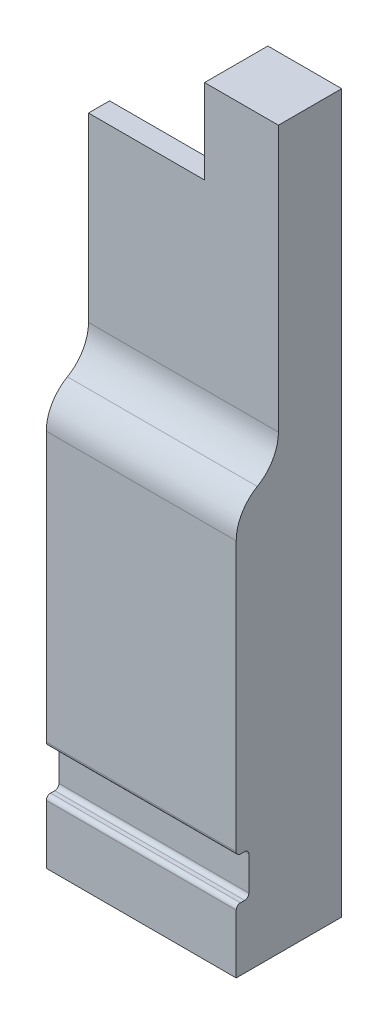
ISO-10303-21;
HEADER;
FILE_DESCRIPTION(('STEP AP214'),'2;1');
FILE_NAME('part.step','',(''),(''),'','','');
FILE_SCHEMA(('AUTOMOTIVE_DESIGN { 1 0 10303 214 1 1 1 1 }'));
ENDSEC;
DATA;
#1=APPLICATION_CONTEXT('core data for automotive mechanical design processes');
#2=APPLICATION_PROTOCOL_DEFINITION('international standard','automotive_design',2000,#1);
#3=PRODUCT_CONTEXT('',#1,'mechanical');
#4=PRODUCT('Part','Part','',(#3));
#5=PRODUCT_RELATED_PRODUCT_CATEGORY('part','',(#4));
#6=PRODUCT_DEFINITION_FORMATION('','',#4);
#7=PRODUCT_DEFINITION_CONTEXT('part definition',#1,'design');
#8=PRODUCT_DEFINITION('design','',#6,#7);
#9=PRODUCT_DEFINITION_SHAPE('','',#8);
#10=(LENGTH_UNIT() NAMED_UNIT(*) SI_UNIT(.MILLI.,.METRE.));
#11=(NAMED_UNIT(*) PLANE_ANGLE_UNIT() SI_UNIT($,.RADIAN.));
#12=(NAMED_UNIT(*) SI_UNIT($,.STERADIAN.) SOLID_ANGLE_UNIT());
#13=UNCERTAINTY_MEASURE_WITH_UNIT(LENGTH_MEASURE(1.E-05),#10,'distance_accuracy_value','');
#14=(GEOMETRIC_REPRESENTATION_CONTEXT(3) GLOBAL_UNCERTAINTY_ASSIGNED_CONTEXT((#13)) GLOBAL_UNIT_ASSIGNED_CONTEXT((#10,
#11,#12)) REPRESENTATION_CONTEXT('',''));
#15=CARTESIAN_POINT('',(0.,0.,0.));
#16=DIRECTION('',(0.,0.,1.));
#17=DIRECTION('',(1.,0.,0.));
#18=AXIS2_PLACEMENT_3D('',#15,#16,#17);
#19=CARTESIAN_POINT('',(40.25,80.25,10.));
#20=DIRECTION('',(0.,1.,0.));
#21=DIRECTION('',(0.,0.,1.));
#22=AXIS2_PLACEMENT_3D('',#19,#20,#21);
#23=PLANE('',#22);
#24=DIRECTION('',(1.,0.,0.));
#25=VECTOR('',#24,1.);
#26=CARTESIAN_POINT('',(40.25,80.25,10.));
#27=LINE('',#26,#25);
#28=CARTESIAN_POINT('',(27.5,80.25,10.));
#29=VERTEX_POINT('',#28);
#30=CARTESIAN_POINT('',(40.25,80.25,10.));
#31=VERTEX_POINT('',#30);
#32=EDGE_CURVE('E298',#29,#31,#27,.T.);
#33=ORIENTED_EDGE('',*,*,#32,.F.);
#34=DIRECTION('',(0.,0.,-1.));
#35=VECTOR('',#34,1.);
#36=CARTESIAN_POINT('',(27.5,80.25,10.));
#37=LINE('',#36,#35);
#38=CARTESIAN_POINT('',(27.5,80.25,0.));
#39=VERTEX_POINT('',#38);
#40=EDGE_CURVE('E344',#29,#39,#37,.T.);
#41=ORIENTED_EDGE('',*,*,#40,.T.);
#42=DIRECTION('',(1.,0.,0.));
#43=VECTOR('',#42,1.);
#44=CARTESIAN_POINT('',(40.25,80.25,0.));
#45=LINE('',#44,#43);
#46=CARTESIAN_POINT('',(40.25,80.25,0.));
#47=VERTEX_POINT('',#46);
#48=EDGE_CURVE('E299',#39,#47,#45,.T.);
#49=ORIENTED_EDGE('',*,*,#48,.T.);
#50=DIRECTION('',(0.,0.,-1.));
#51=VECTOR('',#50,1.);
#52=CARTESIAN_POINT('',(40.25,80.25,10.));
#53=LINE('',#52,#51);
#54=CARTESIAN_POINT('',(40.25,80.25,8.20000000000002));
#55=VERTEX_POINT('',#54);
#56=EDGE_CURVE('E292',#55,#47,#53,.T.);
#57=ORIENTED_EDGE('',*,*,#56,.F.);
#58=DIRECTION('',(1.,0.,0.));
#59=VECTOR('',#58,1.);
#60=CARTESIAN_POINT('',(39.35,80.25,8.20000000000002));
#61=LINE('',#60,#59);
#62=CARTESIAN_POINT('',(39.35,80.25,8.20000000000002));
#63=VERTEX_POINT('',#62);
#64=EDGE_CURVE('E301',#63,#55,#61,.T.);
#65=ORIENTED_EDGE('',*,*,#64,.F.);
#66=DIRECTION('',(0.,0.,-1.));
#67=VECTOR('',#66,1.);
#68=CARTESIAN_POINT('',(39.35,80.25,8.20000000000002));
#69=LINE('',#68,#67);
#70=CARTESIAN_POINT('',(39.35,80.25,8.80000000000002));
#71=VERTEX_POINT('',#70);
#72=EDGE_CURVE('E320',#71,#63,#69,.T.);
#73=ORIENTED_EDGE('',*,*,#72,.F.);
#74=DIRECTION('',(1.,0.,0.));
#75=VECTOR('',#74,1.);
#76=CARTESIAN_POINT('',(39.35,80.25,8.8));
#77=LINE('',#76,#75);
#78=CARTESIAN_POINT('',(40.25,80.25,8.80000000000002));
#79=VERTEX_POINT('',#78);
#80=EDGE_CURVE('E314',#71,#79,#77,.T.);
#81=ORIENTED_EDGE('',*,*,#80,.T.);
#82=EDGE_CURVE('E288',#31,#79,#53,.T.);
#83=ORIENTED_EDGE('',*,*,#82,.F.);
#84=EDGE_LOOP('',(#33,#41,#49,#57,#65,#73,#81,#83));
#85=FACE_BOUND('',#84,.T.);
#86=ADVANCED_FACE('F41',(#85),#23,.F.);
#87=CARTESIAN_POINT('',(-45.,85.,25.));
#88=DIRECTION('',(0.,-1.,0.));
#89=DIRECTION('',(0.,0.,-1.));
#90=AXIS2_PLACEMENT_3D('',#87,#88,#89);
#91=PLANE('',#90);
#92=DIRECTION('',(-1.,0.,0.));
#93=VECTOR('',#92,1.);
#94=CARTESIAN_POINT('',(-45.,85.,0.));
#95=LINE('',#94,#93);
#96=CARTESIAN_POINT('',(45.,85.,0.));
#97=VERTEX_POINT('',#96);
#98=CARTESIAN_POINT('',(27.5,85.,0.));
#99=VERTEX_POINT('',#98);
#100=EDGE_CURVE('E273',#97,#99,#95,.T.);
#101=ORIENTED_EDGE('',*,*,#100,.T.);
#102=DIRECTION('',(0.,0.,1.));
#103=VECTOR('',#102,1.);
#104=CARTESIAN_POINT('',(27.5,85.,25.));
#105=LINE('',#104,#103);
#106=CARTESIAN_POINT('',(27.5,85.,15.));
#107=VERTEX_POINT('',#106);
#108=EDGE_CURVE('E339',#99,#107,#105,.T.);
#109=ORIENTED_EDGE('',*,*,#108,.T.);
#110=DIRECTION('',(-1.,0.,0.));
#111=VECTOR('',#110,1.);
#112=CARTESIAN_POINT('',(45.,85.,15.));
#113=LINE('',#112,#111);
#114=CARTESIAN_POINT('',(45.,85.,15.));
#115=VERTEX_POINT('',#114);
#116=EDGE_CURVE('E279',#115,#107,#113,.T.);
#117=ORIENTED_EDGE('',*,*,#116,.F.);
#118=DIRECTION('',(0.,0.,-1.));
#119=VECTOR('',#118,1.);
#120=CARTESIAN_POINT('',(45.,85.,25.));
#121=LINE('',#120,#119);
#122=EDGE_CURVE('E264',#115,#97,#121,.T.);
#123=ORIENTED_EDGE('',*,*,#122,.T.);
#124=EDGE_LOOP('',(#101,#109,#117,#123));
#125=FACE_BOUND('',#124,.T.);
#126=ADVANCED_FACE('F398',(#125),#91,.F.);
#127=CARTESIAN_POINT('',(0.,0.,0.));
#128=DIRECTION('',(0.,0.,-1.));
#129=DIRECTION('',(-1.,0.,0.));
#130=AXIS2_PLACEMENT_3D('',#127,#128,#129);
#131=PLANE('',#130);
#132=DIRECTION('',(0.,-1.,0.));
#133=VECTOR('',#132,1.);
#134=CARTESIAN_POINT('',(27.5,0.,0.));
#135=LINE('',#134,#133);
#136=EDGE_CURVE('E342',#99,#39,#135,.T.);
#137=ORIENTED_EDGE('',*,*,#136,.F.);
#138=ORIENTED_EDGE('',*,*,#100,.F.);
#139=DIRECTION('',(0.,1.,0.));
#140=VECTOR('',#139,1.);
#141=CARTESIAN_POINT('',(45.,-85.,0.));
#142=LINE('',#141,#140);
#143=CARTESIAN_POINT('',(45.,-85.,0.));
#144=VERTEX_POINT('',#143);
#145=EDGE_CURVE('E276',#144,#97,#142,.T.);
#146=ORIENTED_EDGE('',*,*,#145,.F.);
#147=DIRECTION('',(1.,0.,0.));
#148=VECTOR('',#147,1.);
#149=CARTESIAN_POINT('',(-45.,-85.,0.));
#150=LINE('',#149,#148);
#151=CARTESIAN_POINT('',(40.25,-85.,0.));
#152=VERTEX_POINT('',#151);
#153=EDGE_CURVE('E270',#152,#144,#150,.T.);
#154=ORIENTED_EDGE('',*,*,#153,.F.);
#155=DIRECTION('',(0.,-1.,0.));
#156=VECTOR('',#155,1.);
#157=CARTESIAN_POINT('',(40.25,-85.,0.));
#158=LINE('',#157,#156);
#159=EDGE_CURVE('E295',#47,#152,#158,.T.);
#160=ORIENTED_EDGE('',*,*,#159,.F.);
#161=ORIENTED_EDGE('',*,*,#48,.F.);
#162=EDGE_LOOP('',(#137,#138,#146,#154,#160,#161));
#163=FACE_BOUND('',#162,.T.);
#164=ADVANCED_FACE('F405',(#163),#131,.T.);
#165=CARTESIAN_POINT('',(0.,0.,25.));
#166=DIRECTION('',(0.,0.,-1.));
#167=DIRECTION('',(-1.,0.,0.));
#168=AXIS2_PLACEMENT_3D('',#165,#166,#167);
#169=PLANE('',#168);
#170=DIRECTION('',(1.,0.,0.));
#171=VECTOR('',#170,1.);
#172=CARTESIAN_POINT('',(0.,4.70769186227474,25.));
#173=LINE('',#172,#171);
#174=CARTESIAN_POINT('',(45.,4.70769186227475,25.));
#175=VERTEX_POINT('',#174);
#176=CARTESIAN_POINT('',(0.,4.70769186227474,25.));
#177=VERTEX_POINT('',#176);
#178=EDGE_CURVE('E258',#175,#177,#173,.F.);
#179=ORIENTED_EDGE('',*,*,#178,.T.);
#180=DIRECTION('',(0.,-1.,0.));
#181=VECTOR('',#180,1.);
#182=CARTESIAN_POINT('',(0.,0.,25.));
#183=LINE('',#182,#181);
#184=CARTESIAN_POINT('',(0.,-59.0642013911507,25.));
#185=VERTEX_POINT('',#184);
#186=EDGE_CURVE('E371',#177,#185,#183,.T.);
#187=ORIENTED_EDGE('',*,*,#186,.T.);
#188=DIRECTION('',(-1.,0.,0.));
#189=VECTOR('',#188,1.);
#190=CARTESIAN_POINT('',(0.,-59.0642013911507,25.));
#191=LINE('',#190,#189);
#192=CARTESIAN_POINT('',(45.,-59.0642013911507,25.));
#193=VERTEX_POINT('',#192);
#194=EDGE_CURVE('E241',#185,#193,#191,.F.);
#195=ORIENTED_EDGE('',*,*,#194,.T.);
#196=DIRECTION('',(0.,1.,0.));
#197=VECTOR('',#196,1.);
#198=CARTESIAN_POINT('',(45.,-85.,25.));
#199=LINE('',#198,#197);
#200=EDGE_CURVE('E272',#193,#175,#199,.T.);
#201=ORIENTED_EDGE('',*,*,#200,.T.);
#202=EDGE_LOOP('',(#179,#187,#195,#201));
#203=FACE_BOUND('',#202,.T.);
#204=ADVANCED_FACE('F460',(#203),#169,.F.);
#205=CARTESIAN_POINT('',(40.25,-85.,10.));
#206=DIRECTION('',(1.,0.,0.));
#207=DIRECTION('',(0.,0.,-1.));
#208=AXIS2_PLACEMENT_3D('',#205,#206,#207);
#209=PLANE('',#208);
#210=DIRECTION('',(0.,-1.,0.));
#211=VECTOR('',#210,1.);
#212=CARTESIAN_POINT('',(40.25,-85.,8.20000000000002));
#213=LINE('',#212,#211);
#214=CARTESIAN_POINT('',(40.25,-85.,8.20000000000002));
#215=VERTEX_POINT('',#214);
#216=EDGE_CURVE('E321',#55,#215,#213,.T.);
#217=ORIENTED_EDGE('',*,*,#216,.F.);
#218=ORIENTED_EDGE('',*,*,#56,.T.);
#219=ORIENTED_EDGE('',*,*,#159,.T.);
#220=DIRECTION('',(0.,0.,-1.));
#221=VECTOR('',#220,1.);
#222=CARTESIAN_POINT('',(40.25,-85.,10.));
#223=LINE('',#222,#221);
#224=EDGE_CURVE('E291',#215,#152,#223,.T.);
#225=ORIENTED_EDGE('',*,*,#224,.F.);
#226=EDGE_LOOP('',(#217,#218,#219,#225));
#227=FACE_BOUND('',#226,.T.);
#228=ADVANCED_FACE('F414',(#227),#209,.F.);
#229=DIRECTION('',(0.,1.,0.));
#230=VECTOR('',#229,1.);
#231=CARTESIAN_POINT('',(40.25,80.25,8.8));
#232=LINE('',#231,#230);
#233=CARTESIAN_POINT('',(40.25,-85.,8.80000000000001));
#234=VERTEX_POINT('',#233);
#235=EDGE_CURVE('E317',#234,#79,#232,.T.);
#236=ORIENTED_EDGE('',*,*,#235,.F.);
#237=CARTESIAN_POINT('',(40.25,-85.,10.));
#238=VERTEX_POINT('',#237);
#239=EDGE_CURVE('E287',#238,#234,#223,.T.);
#240=ORIENTED_EDGE('',*,*,#239,.F.);
#241=DIRECTION('',(0.,-1.,0.));
#242=VECTOR('',#241,1.);
#243=CARTESIAN_POINT('',(40.25,-85.,10.));
#244=LINE('',#243,#242);
#245=EDGE_CURVE('E303',#31,#238,#244,.T.);
#246=ORIENTED_EDGE('',*,*,#245,.F.);
#247=ORIENTED_EDGE('',*,*,#82,.T.);
#248=EDGE_LOOP('',(#236,#240,#246,#247));
#249=FACE_BOUND('',#248,.T.);
#250=ADVANCED_FACE('F432',(#249),#209,.F.);
#251=CARTESIAN_POINT('',(45.,-85.,25.));
#252=DIRECTION('',(-1.,0.,0.));
#253=DIRECTION('',(0.,0.,1.));
#254=AXIS2_PLACEMENT_3D('',#251,#252,#253);
#255=PLANE('',#254);
#256=DIRECTION('',(0.,0.,1.));
#257=VECTOR('',#256,1.);
#258=CARTESIAN_POINT('',(45.,-70.0642013911507,22.));
#259=LINE('',#258,#257);
#260=CARTESIAN_POINT('',(45.,-70.0642013911507,23.));
#261=VERTEX_POINT('',#260);
#262=CARTESIAN_POINT('',(45.,-70.0642013911507,24.));
#263=VERTEX_POINT('',#262);
#264=EDGE_CURVE('E333',#261,#263,#259,.T.);
#265=ORIENTED_EDGE('',*,*,#264,.T.);
#266=CARTESIAN_POINT('',(45.,-71.0642013911507,24.));
#267=DIRECTION('',(-1.,0.,0.));
#268=DIRECTION('',(0.,0.,1.));
#269=AXIS2_PLACEMENT_3D('',#266,#267,#268);
#270=CIRCLE('',#269,1.);
#271=CARTESIAN_POINT('',(45.,-71.0642013911507,25.));
#272=VERTEX_POINT('',#271);
#273=EDGE_CURVE('E63',#263,#272,#270,.F.);
#274=ORIENTED_EDGE('',*,*,#273,.T.);
#275=CARTESIAN_POINT('',(45.,-85.,25.));
#276=VERTEX_POINT('',#275);
#277=EDGE_CURVE('E281',#276,#272,#199,.T.);
#278=ORIENTED_EDGE('',*,*,#277,.F.);
#279=DIRECTION('',(0.,0.,-1.));
#280=VECTOR('',#279,1.);
#281=CARTESIAN_POINT('',(45.,-85.,25.));
#282=LINE('',#281,#280);
#283=EDGE_CURVE('E266',#276,#144,#282,.T.);
#284=ORIENTED_EDGE('',*,*,#283,.T.);
#285=ORIENTED_EDGE('',*,*,#145,.T.);
#286=ORIENTED_EDGE('',*,*,#122,.F.);
#287=DIRECTION('',(0.,1.,0.));
#288=VECTOR('',#287,1.);
#289=CARTESIAN_POINT('',(45.,85.,15.));
#290=LINE('',#289,#288);
#291=CARTESIAN_POINT('',(45.,22.0281999379635,15.));
#292=VERTEX_POINT('',#291);
#293=EDGE_CURVE('E285',#292,#115,#290,.T.);
#294=ORIENTED_EDGE('',*,*,#293,.F.);
#295=CARTESIAN_POINT('',(45.,22.0281999379635,25.));
#296=DIRECTION('',(-1.,0.,0.));
#297=DIRECTION('',(0.,0.,1.));
#298=AXIS2_PLACEMENT_3D('',#295,#296,#297);
#299=CIRCLE('',#298,10.);
#300=CARTESIAN_POINT('',(45.,13.3679459001191,20.));
#301=VERTEX_POINT('',#300);
#302=EDGE_CURVE('E251',#292,#301,#299,.T.);
#303=ORIENTED_EDGE('',*,*,#302,.T.);
#304=CARTESIAN_POINT('',(45.,4.70769186227474,15.));
#305=DIRECTION('',(-1.,0.,0.));
#306=DIRECTION('',(0.,0.,1.));
#307=AXIS2_PLACEMENT_3D('',#304,#305,#306);
#308=CIRCLE('',#307,10.);
#309=EDGE_CURVE('E261',#301,#175,#308,.F.);
#310=ORIENTED_EDGE('',*,*,#309,.T.);
#311=ORIENTED_EDGE('',*,*,#200,.F.);
#312=CARTESIAN_POINT('',(45.,-59.0642013911507,24.));
#313=DIRECTION('',(-1.,0.,0.));
#314=DIRECTION('',(0.,0.,1.));
#315=AXIS2_PLACEMENT_3D('',#312,#313,#314);
#316=CIRCLE('',#315,1.);
#317=CARTESIAN_POINT('',(45.,-60.0642013911507,24.));
#318=VERTEX_POINT('',#317);
#319=EDGE_CURVE('E239',#193,#318,#316,.F.);
#320=ORIENTED_EDGE('',*,*,#319,.T.);
#321=DIRECTION('',(0.,0.,1.));
#322=VECTOR('',#321,1.);
#323=CARTESIAN_POINT('',(45.,-60.0642013911507,22.));
#324=LINE('',#323,#322);
#325=CARTESIAN_POINT('',(45.,-60.0642013911507,23.));
#326=VERTEX_POINT('',#325);
#327=EDGE_CURVE('E324',#326,#318,#324,.T.);
#328=ORIENTED_EDGE('',*,*,#327,.F.);
#329=CARTESIAN_POINT('',(45.,-61.0642013911507,23.));
#330=DIRECTION('',(-1.,0.,0.));
#331=DIRECTION('',(0.,0.,1.));
#332=AXIS2_PLACEMENT_3D('',#329,#330,#331);
#333=CIRCLE('',#332,1.);
#334=CARTESIAN_POINT('',(45.,-61.0642013911507,22.));
#335=VERTEX_POINT('',#334);
#336=EDGE_CURVE('E236',#326,#335,#333,.T.);
#337=ORIENTED_EDGE('',*,*,#336,.T.);
#338=DIRECTION('',(0.,1.,0.));
#339=VECTOR('',#338,1.);
#340=CARTESIAN_POINT('',(45.,-70.0642013911507,22.));
#341=LINE('',#340,#339);
#342=CARTESIAN_POINT('',(45.,-69.0642013911507,22.));
#343=VERTEX_POINT('',#342);
#344=EDGE_CURVE('E335',#343,#335,#341,.T.);
#345=ORIENTED_EDGE('',*,*,#344,.F.);
#346=CARTESIAN_POINT('',(45.,-69.0642013911507,23.));
#347=DIRECTION('',(-1.,0.,0.));
#348=DIRECTION('',(0.,0.,1.));
#349=AXIS2_PLACEMENT_3D('',#346,#347,#348);
#350=CIRCLE('',#349,1.);
#351=EDGE_CURVE('E221',#343,#261,#350,.T.);
#352=ORIENTED_EDGE('',*,*,#351,.T.);
#353=EDGE_LOOP('',(#265,#274,#278,#284,#285,#286,#294,#303,#310,#311,#320,#328,#337,#345,#352));
#354=FACE_BOUND('',#353,.T.);
#355=ADVANCED_FACE('F395',(#354),#255,.F.);
#356=CARTESIAN_POINT('',(-45.,-85.,25.));
#357=DIRECTION('',(0.,1.,0.));
#358=DIRECTION('',(0.,0.,1.));
#359=AXIS2_PLACEMENT_3D('',#356,#357,#358);
#360=PLANE('',#359);
#361=DIRECTION('',(1.,0.,0.));
#362=VECTOR('',#361,1.);
#363=CARTESIAN_POINT('',(-45.,-85.,25.));
#364=LINE('',#363,#362);
#365=CARTESIAN_POINT('',(0.,-85.,25.));
#366=VERTEX_POINT('',#365);
#367=EDGE_CURVE('E269',#366,#276,#364,.T.);
#368=ORIENTED_EDGE('',*,*,#367,.F.);
#369=DIRECTION('',(0.,0.,-1.));
#370=VECTOR('',#369,1.);
#371=CARTESIAN_POINT('',(0.,-85.,25.));
#372=LINE('',#371,#370);
#373=CARTESIAN_POINT('',(0.,-85.,10.));
#374=VERTEX_POINT('',#373);
#375=EDGE_CURVE('E382',#366,#374,#372,.T.);
#376=ORIENTED_EDGE('',*,*,#375,.T.);
#377=DIRECTION('',(-1.,0.,0.));
#378=VECTOR('',#377,1.);
#379=CARTESIAN_POINT('',(40.25,-85.,10.));
#380=LINE('',#379,#378);
#381=EDGE_CURVE('E215',#238,#374,#380,.T.);
#382=ORIENTED_EDGE('',*,*,#381,.F.);
#383=ORIENTED_EDGE('',*,*,#239,.T.);
#384=DIRECTION('',(1.,0.,0.));
#385=VECTOR('',#384,1.);
#386=CARTESIAN_POINT('',(39.35,-85.,8.80000000000002));
#387=LINE('',#386,#385);
#388=CARTESIAN_POINT('',(39.35,-85.,8.80000000000002));
#389=VERTEX_POINT('',#388);
#390=EDGE_CURVE('E311',#389,#234,#387,.T.);
#391=ORIENTED_EDGE('',*,*,#390,.F.);
#392=DIRECTION('',(0.,0.,1.));
#393=VECTOR('',#392,1.);
#394=CARTESIAN_POINT('',(39.35,-85.,8.80000000000002));
#395=LINE('',#394,#393);
#396=CARTESIAN_POINT('',(39.35,-85.,8.20000000000002));
#397=VERTEX_POINT('',#396);
#398=EDGE_CURVE('E327',#397,#389,#395,.T.);
#399=ORIENTED_EDGE('',*,*,#398,.F.);
#400=DIRECTION('',(1.,0.,0.));
#401=VECTOR('',#400,1.);
#402=CARTESIAN_POINT('',(39.35,-85.,8.20000000000002));
#403=LINE('',#402,#401);
#404=EDGE_CURVE('E308',#397,#215,#403,.T.);
#405=ORIENTED_EDGE('',*,*,#404,.T.);
#406=ORIENTED_EDGE('',*,*,#224,.T.);
#407=ORIENTED_EDGE('',*,*,#153,.T.);
#408=ORIENTED_EDGE('',*,*,#283,.F.);
#409=EDGE_LOOP('',(#368,#376,#382,#383,#391,#399,#405,#406,#407,#408));
#410=FACE_BOUND('',#409,.T.);
#411=ADVANCED_FACE('F422',(#410),#360,.F.);
#412=DIRECTION('',(1.,0.,0.));
#413=VECTOR('',#412,1.);
#414=CARTESIAN_POINT('',(0.,-71.0642013911507,25.));
#415=LINE('',#414,#413);
#416=CARTESIAN_POINT('',(0.,-71.0642013911507,25.));
#417=VERTEX_POINT('',#416);
#418=EDGE_CURVE('E227',#272,#417,#415,.F.);
#419=ORIENTED_EDGE('',*,*,#418,.T.);
#420=DIRECTION('',(0.,-1.,0.));
#421=VECTOR('',#420,1.);
#422=CARTESIAN_POINT('',(0.,0.,25.));
#423=LINE('',#422,#421);
#424=EDGE_CURVE('E374',#417,#366,#423,.T.);
#425=ORIENTED_EDGE('',*,*,#424,.T.);
#426=ORIENTED_EDGE('',*,*,#367,.T.);
#427=ORIENTED_EDGE('',*,*,#277,.T.);
#428=EDGE_LOOP('',(#419,#425,#426,#427));
#429=FACE_BOUND('',#428,.T.);
#430=ADVANCED_FACE('F456',(#429),#169,.F.);
#431=CARTESIAN_POINT('',(0.,0.,15.));
#432=DIRECTION('',(0.,0.,-1.));
#433=DIRECTION('',(-1.,0.,0.));
#434=AXIS2_PLACEMENT_3D('',#431,#432,#433);
#435=PLANE('',#434);
#436=DIRECTION('',(1.,0.,0.));
#437=VECTOR('',#436,1.);
#438=CARTESIAN_POINT('',(-27.5,65.,15.));
#439=LINE('',#438,#437);
#440=CARTESIAN_POINT('',(0.,65.,15.));
#441=VERTEX_POINT('',#440);
#442=CARTESIAN_POINT('',(27.5,65.,15.));
#443=VERTEX_POINT('',#442);
#444=EDGE_CURVE('E348',#441,#443,#439,.T.);
#445=ORIENTED_EDGE('',*,*,#444,.F.);
#446=DIRECTION('',(0.,-1.,0.));
#447=VECTOR('',#446,1.);
#448=CARTESIAN_POINT('',(0.,0.,15.));
#449=LINE('',#448,#447);
#450=CARTESIAN_POINT('',(0.,22.0281999379635,15.));
#451=VERTEX_POINT('',#450);
#452=EDGE_CURVE('E56',#441,#451,#449,.T.);
#453=ORIENTED_EDGE('',*,*,#452,.T.);
#454=DIRECTION('',(1.,0.,0.));
#455=VECTOR('',#454,1.);
#456=CARTESIAN_POINT('',(0.,22.0281999379635,15.));
#457=LINE('',#456,#455);
#458=EDGE_CURVE('E256',#451,#292,#457,.T.);
#459=ORIENTED_EDGE('',*,*,#458,.T.);
#460=ORIENTED_EDGE('',*,*,#293,.T.);
#461=ORIENTED_EDGE('',*,*,#116,.T.);
#462=DIRECTION('',(0.,1.,0.));
#463=VECTOR('',#462,1.);
#464=CARTESIAN_POINT('',(27.5,105.,15.));
#465=LINE('',#464,#463);
#466=EDGE_CURVE('E350',#443,#107,#465,.T.);
#467=ORIENTED_EDGE('',*,*,#466,.F.);
#468=EDGE_LOOP('',(#445,#453,#459,#460,#461,#467));
#469=FACE_BOUND('',#468,.T.);
#470=ADVANCED_FACE('F386',(#469),#435,.F.);
#471=CARTESIAN_POINT('',(45.,4.70769186227474,15.));
#472=DIRECTION('',(1.,0.,0.));
#473=DIRECTION('',(0.,1.,0.));
#474=AXIS2_PLACEMENT_3D('',#471,#472,#473);
#475=CYLINDRICAL_SURFACE('',#474,10.);
#476=CARTESIAN_POINT('',(0.,4.70769186227474,15.));
#477=DIRECTION('',(1.,0.,0.));
#478=DIRECTION('',(0.,0.,-1.));
#479=AXIS2_PLACEMENT_3D('',#476,#477,#478);
#480=CIRCLE('',#479,10.);
#481=CARTESIAN_POINT('',(0.,13.3679459001191,20.));
#482=VERTEX_POINT('',#481);
#483=EDGE_CURVE('E377',#177,#482,#480,.F.);
#484=ORIENTED_EDGE('',*,*,#483,.F.);
#485=ORIENTED_EDGE('',*,*,#178,.F.);
#486=ORIENTED_EDGE('',*,*,#309,.F.);
#487=DIRECTION('',(1.,0.,0.));
#488=VECTOR('',#487,1.);
#489=CARTESIAN_POINT('',(45.,13.3679459001191,20.));
#490=LINE('',#489,#488);
#491=EDGE_CURVE('E253',#301,#482,#490,.F.);
#492=ORIENTED_EDGE('',*,*,#491,.T.);
#493=EDGE_LOOP('',(#484,#485,#486,#492));
#494=FACE_BOUND('',#493,.T.);
#495=ADVANCED_FACE('F455',(#494),#475,.T.);
#496=CARTESIAN_POINT('',(45.,22.0281999379635,25.));
#497=DIRECTION('',(1.,0.,0.));
#498=DIRECTION('',(0.,1.,0.));
#499=AXIS2_PLACEMENT_3D('',#496,#497,#498);
#500=CYLINDRICAL_SURFACE('',#499,10.);
#501=ORIENTED_EDGE('',*,*,#458,.F.);
#502=CARTESIAN_POINT('',(0.,22.0281999379635,25.));
#503=DIRECTION('',(1.,0.,0.));
#504=DIRECTION('',(0.,0.,-1.));
#505=AXIS2_PLACEMENT_3D('',#502,#503,#504);
#506=CIRCLE('',#505,10.);
#507=EDGE_CURVE('E379',#451,#482,#506,.F.);
#508=ORIENTED_EDGE('',*,*,#507,.T.);
#509=ORIENTED_EDGE('',*,*,#491,.F.);
#510=ORIENTED_EDGE('',*,*,#302,.F.);
#511=EDGE_LOOP('',(#501,#508,#509,#510));
#512=FACE_BOUND('',#511,.T.);
#513=ADVANCED_FACE('F390',(#512),#500,.F.);
#514=CARTESIAN_POINT('',(0.,0.,10.));
#515=DIRECTION('',(0.,0.,1.));
#516=DIRECTION('',(1.,0.,0.));
#517=AXIS2_PLACEMENT_3D('',#514,#515,#516);
#518=PLANE('',#517);
#519=ORIENTED_EDGE('',*,*,#381,.T.);
#520=DIRECTION('',(0.,1.,0.));
#521=VECTOR('',#520,1.);
#522=CARTESIAN_POINT('',(0.,0.,10.));
#523=LINE('',#522,#521);
#524=CARTESIAN_POINT('',(0.,65.,10.));
#525=VERTEX_POINT('',#524);
#526=EDGE_CURVE('E202',#374,#525,#523,.T.);
#527=ORIENTED_EDGE('',*,*,#526,.T.);
#528=DIRECTION('',(1.,0.,0.));
#529=VECTOR('',#528,1.);
#530=CARTESIAN_POINT('',(0.,65.,10.));
#531=LINE('',#530,#529);
#532=CARTESIAN_POINT('',(27.5,65.,10.));
#533=VERTEX_POINT('',#532);
#534=EDGE_CURVE('E211',#525,#533,#531,.T.);
#535=ORIENTED_EDGE('',*,*,#534,.T.);
#536=DIRECTION('',(0.,1.,0.));
#537=VECTOR('',#536,1.);
#538=CARTESIAN_POINT('',(27.5,0.,10.));
#539=LINE('',#538,#537);
#540=EDGE_CURVE('E49',#533,#29,#539,.T.);
#541=ORIENTED_EDGE('',*,*,#540,.T.);
#542=ORIENTED_EDGE('',*,*,#32,.T.);
#543=ORIENTED_EDGE('',*,*,#245,.T.);
#544=EDGE_LOOP('',(#519,#527,#535,#541,#542,#543));
#545=FACE_BOUND('',#544,.T.);
#546=ADVANCED_FACE('F209',(#545),#518,.F.);
#547=CARTESIAN_POINT('',(39.35,-85.,8.20000000000002));
#548=DIRECTION('',(0.,0.,1.));
#549=DIRECTION('',(1.,0.,0.));
#550=AXIS2_PLACEMENT_3D('',#547,#548,#549);
#551=PLANE('',#550);
#552=ORIENTED_EDGE('',*,*,#216,.T.);
#553=ORIENTED_EDGE('',*,*,#404,.F.);
#554=DIRECTION('',(0.,-1.,0.));
#555=VECTOR('',#554,1.);
#556=CARTESIAN_POINT('',(39.35,-85.,8.20000000000002));
#557=LINE('',#556,#555);
#558=EDGE_CURVE('E329',#63,#397,#557,.T.);
#559=ORIENTED_EDGE('',*,*,#558,.F.);
#560=ORIENTED_EDGE('',*,*,#64,.T.);
#561=EDGE_LOOP('',(#552,#553,#559,#560));
#562=FACE_BOUND('',#561,.T.);
#563=ADVANCED_FACE('F417',(#562),#551,.F.);
#564=CARTESIAN_POINT('',(39.35,80.25,8.8));
#565=DIRECTION('',(0.,0.,-1.));
#566=DIRECTION('',(0.,1.,0.));
#567=AXIS2_PLACEMENT_3D('',#564,#565,#566);
#568=PLANE('',#567);
#569=ORIENTED_EDGE('',*,*,#235,.T.);
#570=ORIENTED_EDGE('',*,*,#80,.F.);
#571=DIRECTION('',(0.,1.,0.));
#572=VECTOR('',#571,1.);
#573=CARTESIAN_POINT('',(39.35,80.25,8.8));
#574=LINE('',#573,#572);
#575=EDGE_CURVE('E316',#389,#71,#574,.T.);
#576=ORIENTED_EDGE('',*,*,#575,.F.);
#577=ORIENTED_EDGE('',*,*,#390,.T.);
#578=EDGE_LOOP('',(#569,#570,#576,#577));
#579=FACE_BOUND('',#578,.T.);
#580=ADVANCED_FACE('F433',(#579),#568,.F.);
#581=CARTESIAN_POINT('',(39.35,0.,0.));
#582=DIRECTION('',(1.,0.,0.));
#583=DIRECTION('',(0.,0.,-1.));
#584=AXIS2_PLACEMENT_3D('',#581,#582,#583);
#585=PLANE('',#584);
#586=ORIENTED_EDGE('',*,*,#72,.T.);
#587=ORIENTED_EDGE('',*,*,#558,.T.);
#588=ORIENTED_EDGE('',*,*,#398,.T.);
#589=ORIENTED_EDGE('',*,*,#575,.T.);
#590=EDGE_LOOP('',(#586,#587,#588,#589));
#591=FACE_BOUND('',#590,.T.);
#592=ADVANCED_FACE('F426',(#591),#585,.F.);
#593=CARTESIAN_POINT('',(-45.,-60.0642013911507,22.));
#594=DIRECTION('',(0.,1.,0.));
#595=DIRECTION('',(0.,0.,1.));
#596=AXIS2_PLACEMENT_3D('',#593,#594,#595);
#597=PLANE('',#596);
#598=DIRECTION('',(-1.,0.,0.));
#599=VECTOR('',#598,1.);
#600=CARTESIAN_POINT('',(-45.,-60.0642013911507,24.));
#601=LINE('',#600,#599);
#602=CARTESIAN_POINT('',(0.,-60.0642013911507,24.));
#603=VERTEX_POINT('',#602);
#604=EDGE_CURVE('E245',#318,#603,#601,.T.);
#605=ORIENTED_EDGE('',*,*,#604,.T.);
#606=DIRECTION('',(0.,0.,-1.));
#607=VECTOR('',#606,1.);
#608=CARTESIAN_POINT('',(0.,-60.0642013911507,22.));
#609=LINE('',#608,#607);
#610=CARTESIAN_POINT('',(0.,-60.0642013911507,23.));
#611=VERTEX_POINT('',#610);
#612=EDGE_CURVE('E361',#603,#611,#609,.T.);
#613=ORIENTED_EDGE('',*,*,#612,.T.);
#614=DIRECTION('',(-1.,0.,0.));
#615=VECTOR('',#614,1.);
#616=CARTESIAN_POINT('',(45.,-60.0642013911507,23.));
#617=LINE('',#616,#615);
#618=EDGE_CURVE('E243',#611,#326,#617,.F.);
#619=ORIENTED_EDGE('',*,*,#618,.T.);
#620=ORIENTED_EDGE('',*,*,#327,.T.);
#621=EDGE_LOOP('',(#605,#613,#619,#620));
#622=FACE_BOUND('',#621,.T.);
#623=ADVANCED_FACE('F440',(#622),#597,.F.);
#624=CARTESIAN_POINT('',(-45.,-70.0642013911507,22.));
#625=DIRECTION('',(0.,-1.,0.));
#626=DIRECTION('',(0.,0.,-1.));
#627=AXIS2_PLACEMENT_3D('',#624,#625,#626);
#628=PLANE('',#627);
#629=DIRECTION('',(1.,0.,0.));
#630=VECTOR('',#629,1.);
#631=CARTESIAN_POINT('',(-45.,-70.0642013911507,23.));
#632=LINE('',#631,#630);
#633=CARTESIAN_POINT('',(0.,-70.0642013911507,23.));
#634=VERTEX_POINT('',#633);
#635=EDGE_CURVE('E233',#261,#634,#632,.F.);
#636=ORIENTED_EDGE('',*,*,#635,.T.);
#637=DIRECTION('',(0.,0.,1.));
#638=VECTOR('',#637,1.);
#639=CARTESIAN_POINT('',(0.,-70.0642013911507,22.));
#640=LINE('',#639,#638);
#641=CARTESIAN_POINT('',(0.,-70.0642013911507,24.));
#642=VERTEX_POINT('',#641);
#643=EDGE_CURVE('E364',#634,#642,#640,.T.);
#644=ORIENTED_EDGE('',*,*,#643,.T.);
#645=DIRECTION('',(1.,0.,0.));
#646=VECTOR('',#645,1.);
#647=CARTESIAN_POINT('',(-45.,-70.0642013911507,24.));
#648=LINE('',#647,#646);
#649=EDGE_CURVE('E231',#642,#263,#648,.T.);
#650=ORIENTED_EDGE('',*,*,#649,.T.);
#651=ORIENTED_EDGE('',*,*,#264,.F.);
#652=EDGE_LOOP('',(#636,#644,#650,#651));
#653=FACE_BOUND('',#652,.T.);
#654=ADVANCED_FACE('F491',(#653),#628,.F.);
#655=CARTESIAN_POINT('',(0.,0.,22.));
#656=DIRECTION('',(0.,0.,-1.));
#657=DIRECTION('',(-1.,0.,0.));
#658=AXIS2_PLACEMENT_3D('',#655,#656,#657);
#659=PLANE('',#658);
#660=DIRECTION('',(-1.,0.,0.));
#661=VECTOR('',#660,1.);
#662=CARTESIAN_POINT('',(-45.,-61.0642013911507,22.));
#663=LINE('',#662,#661);
#664=CARTESIAN_POINT('',(0.,-61.0642013911507,22.));
#665=VERTEX_POINT('',#664);
#666=EDGE_CURVE('E248',#335,#665,#663,.T.);
#667=ORIENTED_EDGE('',*,*,#666,.T.);
#668=DIRECTION('',(0.,-1.,0.));
#669=VECTOR('',#668,1.);
#670=CARTESIAN_POINT('',(0.,0.,22.));
#671=LINE('',#670,#669);
#672=CARTESIAN_POINT('',(0.,-69.0642013911507,22.));
#673=VERTEX_POINT('',#672);
#674=EDGE_CURVE('E352',#665,#673,#671,.T.);
#675=ORIENTED_EDGE('',*,*,#674,.T.);
#676=DIRECTION('',(1.,0.,0.));
#677=VECTOR('',#676,1.);
#678=CARTESIAN_POINT('',(45.,-69.0642013911507,22.));
#679=LINE('',#678,#677);
#680=EDGE_CURVE('E223',#673,#343,#679,.T.);
#681=ORIENTED_EDGE('',*,*,#680,.T.);
#682=ORIENTED_EDGE('',*,*,#344,.T.);
#683=EDGE_LOOP('',(#667,#675,#681,#682));
#684=FACE_BOUND('',#683,.T.);
#685=ADVANCED_FACE('F475',(#684),#659,.F.);
#686=CARTESIAN_POINT('',(0.,-61.0642013911507,23.));
#687=DIRECTION('',(1.,0.,0.));
#688=DIRECTION('',(0.,0.,-1.));
#689=AXIS2_PLACEMENT_3D('',#686,#687,#688);
#690=CYLINDRICAL_SURFACE('',#689,1.);
#691=ORIENTED_EDGE('',*,*,#618,.F.);
#692=CARTESIAN_POINT('',(0.,-61.0642013911507,23.));
#693=DIRECTION('',(1.,0.,0.));
#694=DIRECTION('',(0.,0.,-1.));
#695=AXIS2_PLACEMENT_3D('',#692,#693,#694);
#696=CIRCLE('',#695,1.);
#697=EDGE_CURVE('E355',#611,#665,#696,.F.);
#698=ORIENTED_EDGE('',*,*,#697,.T.);
#699=ORIENTED_EDGE('',*,*,#666,.F.);
#700=ORIENTED_EDGE('',*,*,#336,.F.);
#701=EDGE_LOOP('',(#691,#698,#699,#700));
#702=FACE_BOUND('',#701,.T.);
#703=ADVANCED_FACE('F471',(#702),#690,.F.);
#704=CARTESIAN_POINT('',(-45.,-59.0642013911507,24.));
#705=DIRECTION('',(-1.,0.,0.));
#706=DIRECTION('',(0.,0.,1.));
#707=AXIS2_PLACEMENT_3D('',#704,#705,#706);
#708=CYLINDRICAL_SURFACE('',#707,1.);
#709=CARTESIAN_POINT('',(0.,-59.0642013911507,24.));
#710=DIRECTION('',(1.,0.,0.));
#711=DIRECTION('',(0.,0.,-1.));
#712=AXIS2_PLACEMENT_3D('',#709,#710,#711);
#713=CIRCLE('',#712,1.);
#714=EDGE_CURVE('E367',#603,#185,#713,.F.);
#715=ORIENTED_EDGE('',*,*,#714,.F.);
#716=ORIENTED_EDGE('',*,*,#604,.F.);
#717=ORIENTED_EDGE('',*,*,#319,.F.);
#718=ORIENTED_EDGE('',*,*,#194,.F.);
#719=EDGE_LOOP('',(#715,#716,#717,#718));
#720=FACE_BOUND('',#719,.T.);
#721=ADVANCED_FACE('F474',(#720),#708,.T.);
#722=CARTESIAN_POINT('',(-45.,-71.0642013911507,24.));
#723=DIRECTION('',(1.,0.,0.));
#724=DIRECTION('',(0.,0.,-1.));
#725=AXIS2_PLACEMENT_3D('',#722,#723,#724);
#726=CYLINDRICAL_SURFACE('',#725,1.);
#727=CARTESIAN_POINT('',(0.,-71.0642013911507,24.));
#728=DIRECTION('',(1.,0.,0.));
#729=DIRECTION('',(0.,0.,-1.));
#730=AXIS2_PLACEMENT_3D('',#727,#728,#729);
#731=CIRCLE('',#730,1.);
#732=EDGE_CURVE('E369',#417,#642,#731,.F.);
#733=ORIENTED_EDGE('',*,*,#732,.F.);
#734=ORIENTED_EDGE('',*,*,#418,.F.);
#735=ORIENTED_EDGE('',*,*,#273,.F.);
#736=ORIENTED_EDGE('',*,*,#649,.F.);
#737=EDGE_LOOP('',(#733,#734,#735,#736));
#738=FACE_BOUND('',#737,.T.);
#739=ADVANCED_FACE('F478',(#738),#726,.T.);
#740=CARTESIAN_POINT('',(0.,-69.0642013911507,23.));
#741=DIRECTION('',(-1.,0.,0.));
#742=DIRECTION('',(0.,0.,1.));
#743=AXIS2_PLACEMENT_3D('',#740,#741,#742);
#744=CYLINDRICAL_SURFACE('',#743,1.);
#745=ORIENTED_EDGE('',*,*,#680,.F.);
#746=CARTESIAN_POINT('',(0.,-69.0642013911507,23.));
#747=DIRECTION('',(1.,0.,0.));
#748=DIRECTION('',(0.,0.,-1.));
#749=AXIS2_PLACEMENT_3D('',#746,#747,#748);
#750=CIRCLE('',#749,1.);
#751=EDGE_CURVE('E358',#673,#634,#750,.F.);
#752=ORIENTED_EDGE('',*,*,#751,.T.);
#753=ORIENTED_EDGE('',*,*,#635,.F.);
#754=ORIENTED_EDGE('',*,*,#351,.F.);
#755=EDGE_LOOP('',(#745,#752,#753,#754));
#756=FACE_BOUND('',#755,.T.);
#757=ADVANCED_FACE('F43',(#756),#744,.F.);
#758=CARTESIAN_POINT('',(27.5,105.,-5.));
#759=DIRECTION('',(1.,0.,0.));
#760=DIRECTION('',(0.,1.,0.));
#761=AXIS2_PLACEMENT_3D('',#758,#759,#760);
#762=PLANE('',#761);
#763=ORIENTED_EDGE('',*,*,#136,.T.);
#764=ORIENTED_EDGE('',*,*,#40,.F.);
#765=ORIENTED_EDGE('',*,*,#540,.F.);
#766=DIRECTION('',(0.,0.,1.));
#767=VECTOR('',#766,1.);
#768=CARTESIAN_POINT('',(27.5,65.,-5.));
#769=LINE('',#768,#767);
#770=EDGE_CURVE('E220',#533,#443,#769,.T.);
#771=ORIENTED_EDGE('',*,*,#770,.T.);
#772=ORIENTED_EDGE('',*,*,#466,.T.);
#773=ORIENTED_EDGE('',*,*,#108,.F.);
#774=EDGE_LOOP('',(#763,#764,#765,#771,#772,#773));
#775=FACE_BOUND('',#774,.T.);
#776=ADVANCED_FACE('F402',(#775),#762,.F.);
#777=CARTESIAN_POINT('',(-27.5,65.,-5.));
#778=DIRECTION('',(0.,-1.,0.));
#779=DIRECTION('',(0.,0.,-1.));
#780=AXIS2_PLACEMENT_3D('',#777,#778,#779);
#781=PLANE('',#780);
#782=ORIENTED_EDGE('',*,*,#534,.F.);
#783=DIRECTION('',(0.,0.,1.));
#784=VECTOR('',#783,1.);
#785=CARTESIAN_POINT('',(0.,65.,-5.));
#786=LINE('',#785,#784);
#787=EDGE_CURVE('E11',#525,#441,#786,.T.);
#788=ORIENTED_EDGE('',*,*,#787,.T.);
#789=ORIENTED_EDGE('',*,*,#444,.T.);
#790=ORIENTED_EDGE('',*,*,#770,.F.);
#791=EDGE_LOOP('',(#782,#788,#789,#790));
#792=FACE_BOUND('',#791,.T.);
#793=ADVANCED_FACE('F218',(#792),#781,.F.);
#794=CARTESIAN_POINT('',(0.,0.,0.));
#795=DIRECTION('',(1.,0.,0.));
#796=DIRECTION('',(0.,0.,-1.));
#797=AXIS2_PLACEMENT_3D('',#794,#795,#796);
#798=PLANE('',#797);
#799=ORIENTED_EDGE('',*,*,#697,.F.);
#800=ORIENTED_EDGE('',*,*,#612,.F.);
#801=ORIENTED_EDGE('',*,*,#714,.T.);
#802=ORIENTED_EDGE('',*,*,#186,.F.);
#803=ORIENTED_EDGE('',*,*,#483,.T.);
#804=ORIENTED_EDGE('',*,*,#507,.F.);
#805=ORIENTED_EDGE('',*,*,#452,.F.);
#806=ORIENTED_EDGE('',*,*,#787,.F.);
#807=ORIENTED_EDGE('',*,*,#526,.F.);
#808=ORIENTED_EDGE('',*,*,#375,.F.);
#809=ORIENTED_EDGE('',*,*,#424,.F.);
#810=ORIENTED_EDGE('',*,*,#732,.T.);
#811=ORIENTED_EDGE('',*,*,#643,.F.);
#812=ORIENTED_EDGE('',*,*,#751,.F.);
#813=ORIENTED_EDGE('',*,*,#674,.F.);
#814=EDGE_LOOP('',(#799,#800,#801,#802,#803,#804,#805,#806,#807,#808,#809,#810,#811,#812,#813));
#815=FACE_BOUND('',#814,.T.);
#816=ADVANCED_FACE('F201',(#815),#798,.F.);
#817=CLOSED_SHELL('',(#86,#126,#164,#204,#228,#250,#355,#411,#430,#470,#495,#513,#546,#563,#580,
#592,#623,#654,#685,#703,#721,#739,#757,#776,#793,#816));
#818=MANIFOLD_SOLID_BREP('B2',#817);
#819=ADVANCED_BREP_SHAPE_REPRESENTATION('',(#18,#818),#14);
#820=SHAPE_DEFINITION_REPRESENTATION(#9,#819);
ENDSEC;
END-ISO-10303-21;
